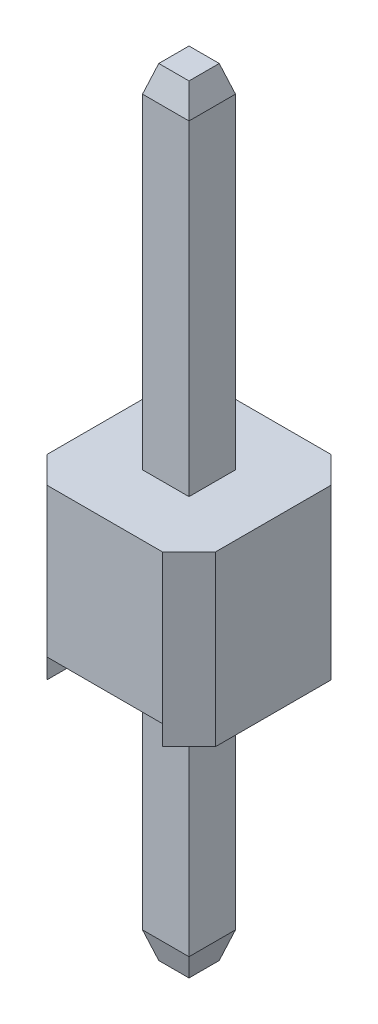
ISO-10303-21;
HEADER;
FILE_DESCRIPTION(('STEP AP214'),'2;1');
FILE_NAME('part.step','',(''),(''),'','','');
FILE_SCHEMA(('AUTOMOTIVE_DESIGN { 1 0 10303 214 1 1 1 1 }'));
ENDSEC;
DATA;
#1=APPLICATION_CONTEXT('core data for automotive mechanical design processes');
#2=APPLICATION_PROTOCOL_DEFINITION('international standard','automotive_design',2000,#1);
#3=PRODUCT_CONTEXT('',#1,'mechanical');
#4=PRODUCT('Part','Part','',(#3));
#5=PRODUCT_RELATED_PRODUCT_CATEGORY('part','',(#4));
#6=PRODUCT_DEFINITION_FORMATION('','',#4);
#7=PRODUCT_DEFINITION_CONTEXT('part definition',#1,'design');
#8=PRODUCT_DEFINITION('design','',#6,#7);
#9=PRODUCT_DEFINITION_SHAPE('','',#8);
#10=(LENGTH_UNIT() NAMED_UNIT(*) SI_UNIT(.MILLI.,.METRE.));
#11=(NAMED_UNIT(*) PLANE_ANGLE_UNIT() SI_UNIT($,.RADIAN.));
#12=(NAMED_UNIT(*) SI_UNIT($,.STERADIAN.) SOLID_ANGLE_UNIT());
#13=UNCERTAINTY_MEASURE_WITH_UNIT(LENGTH_MEASURE(1.E-05),#10,'distance_accuracy_value','');
#14=(GEOMETRIC_REPRESENTATION_CONTEXT(3) GLOBAL_UNCERTAINTY_ASSIGNED_CONTEXT((#13)) GLOBAL_UNIT_ASSIGNED_CONTEXT((#10,
#11,#12)) REPRESENTATION_CONTEXT('',''));
#15=CARTESIAN_POINT('',(0.,0.,0.));
#16=DIRECTION('',(0.,0.,1.));
#17=DIRECTION('',(1.,0.,0.));
#18=AXIS2_PLACEMENT_3D('',#15,#16,#17);
#19=CARTESIAN_POINT('',(0.,0.3,0.));
#20=DIRECTION('',(0.,-1.,0.));
#21=DIRECTION('',(0.,0.,-1.));
#22=AXIS2_PLACEMENT_3D('',#19,#20,#21);
#23=PLANE('',#22);
#24=DIRECTION('',(0.,0.,-1.));
#25=VECTOR('',#24,1.);
#26=CARTESIAN_POINT('',(-0.870000000000001,0.3,1.27));
#27=LINE('',#26,#25);
#28=CARTESIAN_POINT('',(-0.870000000000001,0.3,1.27));
#29=VERTEX_POINT('',#28);
#30=CARTESIAN_POINT('',(-0.870000000000001,0.3,-1.27));
#31=VERTEX_POINT('',#30);
#32=EDGE_CURVE('E242',#29,#31,#27,.T.);
#33=ORIENTED_EDGE('',*,*,#32,.T.);
#34=DIRECTION('',(1.,0.,0.));
#35=VECTOR('',#34,1.);
#36=CARTESIAN_POINT('',(-0.870000000000001,0.3,-1.27));
#37=LINE('',#36,#35);
#38=CARTESIAN_POINT('',(0.869999999999999,0.3,-1.27));
#39=VERTEX_POINT('',#38);
#40=EDGE_CURVE('E245',#31,#39,#37,.T.);
#41=ORIENTED_EDGE('',*,*,#40,.T.);
#42=DIRECTION('',(0.,0.,1.));
#43=VECTOR('',#42,1.);
#44=CARTESIAN_POINT('',(0.869999999999999,0.3,1.27));
#45=LINE('',#44,#43);
#46=CARTESIAN_POINT('',(0.869999999999999,0.3,1.27));
#47=VERTEX_POINT('',#46);
#48=EDGE_CURVE('E249',#39,#47,#45,.T.);
#49=ORIENTED_EDGE('',*,*,#48,.T.);
#50=DIRECTION('',(-1.,0.,0.));
#51=VECTOR('',#50,1.);
#52=CARTESIAN_POINT('',(-0.870000000000001,0.3,1.27));
#53=LINE('',#52,#51);
#54=EDGE_CURVE('E252',#47,#29,#53,.T.);
#55=ORIENTED_EDGE('',*,*,#54,.T.);
#56=EDGE_LOOP('',(#33,#41,#49,#55));
#57=FACE_BOUND('',#56,.T.);
#58=DIRECTION('',(-1.,0.,0.));
#59=VECTOR('',#58,1.);
#60=CARTESIAN_POINT('',(-0.35,0.3,0.35));
#61=LINE('',#60,#59);
#62=CARTESIAN_POINT('',(0.35,0.3,0.35));
#63=VERTEX_POINT('',#62);
#64=CARTESIAN_POINT('',(-0.35,0.3,0.35));
#65=VERTEX_POINT('',#64);
#66=EDGE_CURVE('E211',#63,#65,#61,.T.);
#67=ORIENTED_EDGE('',*,*,#66,.F.);
#68=DIRECTION('',(0.,0.,1.));
#69=VECTOR('',#68,1.);
#70=CARTESIAN_POINT('',(0.35,0.3,0.35));
#71=LINE('',#70,#69);
#72=CARTESIAN_POINT('',(0.35,0.3,-0.35));
#73=VERTEX_POINT('',#72);
#74=EDGE_CURVE('E191',#73,#63,#71,.T.);
#75=ORIENTED_EDGE('',*,*,#74,.F.);
#76=DIRECTION('',(1.,0.,0.));
#77=VECTOR('',#76,1.);
#78=CARTESIAN_POINT('',(-0.35,0.3,-0.35));
#79=LINE('',#78,#77);
#80=CARTESIAN_POINT('',(-0.35,0.3,-0.35));
#81=VERTEX_POINT('',#80);
#82=EDGE_CURVE('E201',#81,#73,#79,.T.);
#83=ORIENTED_EDGE('',*,*,#82,.F.);
#84=DIRECTION('',(0.,0.,-1.));
#85=VECTOR('',#84,1.);
#86=CARTESIAN_POINT('',(-0.35,0.3,0.35));
#87=LINE('',#86,#85);
#88=EDGE_CURVE('E220',#65,#81,#87,.T.);
#89=ORIENTED_EDGE('',*,*,#88,.F.);
#90=EDGE_LOOP('',(#67,#75,#83,#89));
#91=FACE_BOUND('',#90,.T.);
#92=ADVANCED_FACE('F37',(#57,#91),#23,.T.);
#93=CARTESIAN_POINT('',(0.,2.54,0.));
#94=DIRECTION('',(0.,1.,0.));
#95=DIRECTION('',(0.,0.,1.));
#96=AXIS2_PLACEMENT_3D('',#93,#94,#95);
#97=PLANE('',#96);
#98=DIRECTION('',(-1.,0.,0.));
#99=VECTOR('',#98,1.);
#100=CARTESIAN_POINT('',(-1.27,2.54,-1.27));
#101=LINE('',#100,#99);
#102=CARTESIAN_POINT('',(0.869999999999999,2.54,-1.27));
#103=VERTEX_POINT('',#102);
#104=CARTESIAN_POINT('',(-0.869999999999999,2.54,-1.27));
#105=VERTEX_POINT('',#104);
#106=EDGE_CURVE('E265',#103,#105,#101,.T.);
#107=ORIENTED_EDGE('',*,*,#106,.T.);
#108=DIRECTION('',(0.707106781186548,0.,-0.707106781186547));
#109=VECTOR('',#108,1.);
#110=CARTESIAN_POINT('',(-1.07,2.54,-1.07));
#111=LINE('',#110,#109);
#112=CARTESIAN_POINT('',(-1.27,2.54,-0.869999999999999));
#113=VERTEX_POINT('',#112);
#114=EDGE_CURVE('E306',#105,#113,#111,.F.);
#115=ORIENTED_EDGE('',*,*,#114,.T.);
#116=DIRECTION('',(0.,0.,1.));
#117=VECTOR('',#116,1.);
#118=CARTESIAN_POINT('',(-1.27,2.54,-1.27));
#119=LINE('',#118,#117);
#120=CARTESIAN_POINT('',(-1.27,2.54,0.869999999999999));
#121=VERTEX_POINT('',#120);
#122=EDGE_CURVE('E269',#113,#121,#119,.T.);
#123=ORIENTED_EDGE('',*,*,#122,.T.);
#124=DIRECTION('',(-0.707106781186546,0.,-0.707106781186549));
#125=VECTOR('',#124,1.);
#126=CARTESIAN_POINT('',(-1.07,2.54,1.07));
#127=LINE('',#126,#125);
#128=CARTESIAN_POINT('',(-0.87,2.54,1.27));
#129=VERTEX_POINT('',#128);
#130=EDGE_CURVE('E302',#121,#129,#127,.F.);
#131=ORIENTED_EDGE('',*,*,#130,.T.);
#132=DIRECTION('',(1.,0.,0.));
#133=VECTOR('',#132,1.);
#134=CARTESIAN_POINT('',(-1.27,2.54,1.27));
#135=LINE('',#134,#133);
#136=CARTESIAN_POINT('',(0.869999999999998,2.54,1.27));
#137=VERTEX_POINT('',#136);
#138=EDGE_CURVE('E272',#129,#137,#135,.T.);
#139=ORIENTED_EDGE('',*,*,#138,.T.);
#140=DIRECTION('',(-0.707106781186549,0.,0.707106781186546));
#141=VECTOR('',#140,1.);
#142=CARTESIAN_POINT('',(1.07,2.54,1.07));
#143=LINE('',#142,#141);
#144=CARTESIAN_POINT('',(1.27,2.54,0.869999999999999));
#145=VERTEX_POINT('',#144);
#146=EDGE_CURVE('E300',#137,#145,#143,.F.);
#147=ORIENTED_EDGE('',*,*,#146,.T.);
#148=DIRECTION('',(0.,0.,-1.));
#149=VECTOR('',#148,1.);
#150=CARTESIAN_POINT('',(1.27,2.54,-1.27));
#151=LINE('',#150,#149);
#152=CARTESIAN_POINT('',(1.27,2.54,-0.869999999999999));
#153=VERTEX_POINT('',#152);
#154=EDGE_CURVE('E262',#145,#153,#151,.T.);
#155=ORIENTED_EDGE('',*,*,#154,.T.);
#156=DIRECTION('',(0.707106781186547,0.,0.707106781186548));
#157=VECTOR('',#156,1.);
#158=CARTESIAN_POINT('',(1.07,2.54,-1.07));
#159=LINE('',#158,#157);
#160=EDGE_CURVE('E304',#153,#103,#159,.F.);
#161=ORIENTED_EDGE('',*,*,#160,.T.);
#162=EDGE_LOOP('',(#107,#115,#123,#131,#139,#147,#155,#161));
#163=FACE_BOUND('',#162,.T.);
#164=DIRECTION('',(1.,0.,0.));
#165=VECTOR('',#164,1.);
#166=CARTESIAN_POINT('',(0.35,2.54,0.35));
#167=LINE('',#166,#165);
#168=CARTESIAN_POINT('',(-0.35,2.54,0.35));
#169=VERTEX_POINT('',#168);
#170=CARTESIAN_POINT('',(0.35,2.54,0.35));
#171=VERTEX_POINT('',#170);
#172=EDGE_CURVE('E224',#169,#171,#167,.T.);
#173=ORIENTED_EDGE('',*,*,#172,.F.);
#174=DIRECTION('',(0.,0.,1.));
#175=VECTOR('',#174,1.);
#176=CARTESIAN_POINT('',(-0.35,2.54,-0.35));
#177=LINE('',#176,#175);
#178=CARTESIAN_POINT('',(-0.35,2.54,-0.35));
#179=VERTEX_POINT('',#178);
#180=EDGE_CURVE('E208',#179,#169,#177,.T.);
#181=ORIENTED_EDGE('',*,*,#180,.F.);
#182=DIRECTION('',(-1.,0.,0.));
#183=VECTOR('',#182,1.);
#184=CARTESIAN_POINT('',(0.35,2.54,-0.35));
#185=LINE('',#184,#183);
#186=CARTESIAN_POINT('',(0.35,2.54,-0.35));
#187=VERTEX_POINT('',#186);
#188=EDGE_CURVE('E230',#187,#179,#185,.T.);
#189=ORIENTED_EDGE('',*,*,#188,.F.);
#190=DIRECTION('',(0.,0.,-1.));
#191=VECTOR('',#190,1.);
#192=CARTESIAN_POINT('',(0.35,2.54,-0.35));
#193=LINE('',#192,#191);
#194=EDGE_CURVE('E227',#171,#187,#193,.T.);
#195=ORIENTED_EDGE('',*,*,#194,.F.);
#196=EDGE_LOOP('',(#173,#181,#189,#195));
#197=FACE_BOUND('',#196,.T.);
#198=ADVANCED_FACE('F403',(#163,#197),#97,.T.);
#199=CARTESIAN_POINT('',(-1.27,2.54,-1.27));
#200=DIRECTION('',(0.,0.,1.));
#201=DIRECTION('',(1.,0.,0.));
#202=AXIS2_PLACEMENT_3D('',#199,#200,#201);
#203=PLANE('',#202);
#204=ORIENTED_EDGE('',*,*,#40,.F.);
#205=DIRECTION('',(0.,1.,0.));
#206=VECTOR('',#205,1.);
#207=CARTESIAN_POINT('',(-0.869999999999999,2.54,-1.27));
#208=LINE('',#207,#206);
#209=EDGE_CURVE('E297',#31,#105,#208,.T.);
#210=ORIENTED_EDGE('',*,*,#209,.T.);
#211=ORIENTED_EDGE('',*,*,#106,.F.);
#212=DIRECTION('',(0.,-1.,0.));
#213=VECTOR('',#212,1.);
#214=CARTESIAN_POINT('',(0.869999999999999,2.54,-1.27));
#215=LINE('',#214,#213);
#216=EDGE_CURVE('E294',#103,#39,#215,.T.);
#217=ORIENTED_EDGE('',*,*,#216,.T.);
#218=EDGE_LOOP('',(#204,#210,#211,#217));
#219=FACE_BOUND('',#218,.T.);
#220=ADVANCED_FACE('F409',(#219),#203,.F.);
#221=CARTESIAN_POINT('',(-1.27,2.54,1.27));
#222=DIRECTION('',(0.,0.,-1.));
#223=DIRECTION('',(-1.,0.,0.));
#224=AXIS2_PLACEMENT_3D('',#221,#222,#223);
#225=PLANE('',#224);
#226=ORIENTED_EDGE('',*,*,#54,.F.);
#227=DIRECTION('',(0.,1.,0.));
#228=VECTOR('',#227,1.);
#229=CARTESIAN_POINT('',(0.869999999999999,2.54,1.27));
#230=LINE('',#229,#228);
#231=EDGE_CURVE('E313',#47,#137,#230,.T.);
#232=ORIENTED_EDGE('',*,*,#231,.T.);
#233=ORIENTED_EDGE('',*,*,#138,.F.);
#234=DIRECTION('',(0.,-1.,0.));
#235=VECTOR('',#234,1.);
#236=CARTESIAN_POINT('',(-0.87,2.54,1.27));
#237=LINE('',#236,#235);
#238=EDGE_CURVE('E316',#129,#29,#237,.T.);
#239=ORIENTED_EDGE('',*,*,#238,.T.);
#240=EDGE_LOOP('',(#226,#232,#233,#239));
#241=FACE_BOUND('',#240,.T.);
#242=ADVANCED_FACE('F431',(#241),#225,.F.);
#243=CARTESIAN_POINT('',(0.,0.,0.));
#244=DIRECTION('',(0.,1.,0.));
#245=DIRECTION('',(0.,0.,1.));
#246=AXIS2_PLACEMENT_3D('',#243,#244,#245);
#247=PLANE('',#246);
#248=DIRECTION('',(-0.707106781186548,0.,0.707106781186547));
#249=VECTOR('',#248,1.);
#250=CARTESIAN_POINT('',(-1.27,0.,-0.869999999999999));
#251=LINE('',#250,#249);
#252=CARTESIAN_POINT('',(-1.27,0.,-0.869999999999999));
#253=VERTEX_POINT('',#252);
#254=CARTESIAN_POINT('',(-0.870000000000001,0.,-1.27));
#255=VERTEX_POINT('',#254);
#256=EDGE_CURVE('E291',#253,#255,#251,.F.);
#257=ORIENTED_EDGE('',*,*,#256,.T.);
#258=DIRECTION('',(0.,0.,-1.));
#259=VECTOR('',#258,1.);
#260=CARTESIAN_POINT('',(-0.870000000000001,0.,1.27));
#261=LINE('',#260,#259);
#262=CARTESIAN_POINT('',(-0.870000000000001,0.,1.27));
#263=VERTEX_POINT('',#262);
#264=EDGE_CURVE('E241',#263,#255,#261,.T.);
#265=ORIENTED_EDGE('',*,*,#264,.F.);
#266=DIRECTION('',(0.707106781186546,0.,0.707106781186549));
#267=VECTOR('',#266,1.);
#268=CARTESIAN_POINT('',(-0.87,0.,1.27));
#269=LINE('',#268,#267);
#270=CARTESIAN_POINT('',(-1.27,0.,0.869999999999999));
#271=VERTEX_POINT('',#270);
#272=EDGE_CURVE('E287',#263,#271,#269,.F.);
#273=ORIENTED_EDGE('',*,*,#272,.T.);
#274=DIRECTION('',(0.,0.,1.));
#275=VECTOR('',#274,1.);
#276=CARTESIAN_POINT('',(-1.27,0.,-1.27));
#277=LINE('',#276,#275);
#278=EDGE_CURVE('E266',#253,#271,#277,.T.);
#279=ORIENTED_EDGE('',*,*,#278,.F.);
#280=EDGE_LOOP('',(#257,#265,#273,#279));
#281=FACE_BOUND('',#280,.T.);
#282=ADVANCED_FACE('F430',(#281),#247,.F.);
#283=CARTESIAN_POINT('',(1.27,2.54,-1.27));
#284=DIRECTION('',(-1.,0.,0.));
#285=DIRECTION('',(0.,0.,1.));
#286=AXIS2_PLACEMENT_3D('',#283,#284,#285);
#287=PLANE('',#286);
#288=DIRECTION('',(0.,0.,-1.));
#289=VECTOR('',#288,1.);
#290=CARTESIAN_POINT('',(1.27,0.,-1.27));
#291=LINE('',#290,#289);
#292=CARTESIAN_POINT('',(1.27,0.,0.87));
#293=VERTEX_POINT('',#292);
#294=CARTESIAN_POINT('',(1.27,0.,-0.869999999999998));
#295=VERTEX_POINT('',#294);
#296=EDGE_CURVE('E260',#293,#295,#291,.T.);
#297=ORIENTED_EDGE('',*,*,#296,.T.);
#298=DIRECTION('',(0.,1.,0.));
#299=VECTOR('',#298,1.);
#300=CARTESIAN_POINT('',(1.27,2.54,-0.869999999999998));
#301=LINE('',#300,#299);
#302=EDGE_CURVE('E311',#295,#153,#301,.T.);
#303=ORIENTED_EDGE('',*,*,#302,.T.);
#304=ORIENTED_EDGE('',*,*,#154,.F.);
#305=DIRECTION('',(0.,-1.,0.));
#306=VECTOR('',#305,1.);
#307=CARTESIAN_POINT('',(1.27,2.54,0.870000000000001));
#308=LINE('',#307,#306);
#309=EDGE_CURVE('E308',#145,#293,#308,.T.);
#310=ORIENTED_EDGE('',*,*,#309,.T.);
#311=EDGE_LOOP('',(#297,#303,#304,#310));
#312=FACE_BOUND('',#311,.T.);
#313=ADVANCED_FACE('F437',(#312),#287,.F.);
#314=CARTESIAN_POINT('',(-1.27,2.54,-1.27));
#315=DIRECTION('',(1.,0.,0.));
#316=DIRECTION('',(0.,0.,-1.));
#317=AXIS2_PLACEMENT_3D('',#314,#315,#316);
#318=PLANE('',#317);
#319=ORIENTED_EDGE('',*,*,#122,.F.);
#320=DIRECTION('',(0.,-1.,0.));
#321=VECTOR('',#320,1.);
#322=CARTESIAN_POINT('',(-1.27,2.54,-0.869999999999999));
#323=LINE('',#322,#321);
#324=EDGE_CURVE('E281',#113,#253,#323,.T.);
#325=ORIENTED_EDGE('',*,*,#324,.T.);
#326=ORIENTED_EDGE('',*,*,#278,.T.);
#327=DIRECTION('',(0.,1.,0.));
#328=VECTOR('',#327,1.);
#329=CARTESIAN_POINT('',(-1.27,2.54,0.869999999999999));
#330=LINE('',#329,#328);
#331=EDGE_CURVE('E275',#271,#121,#330,.T.);
#332=ORIENTED_EDGE('',*,*,#331,.T.);
#333=EDGE_LOOP('',(#319,#325,#326,#332));
#334=FACE_BOUND('',#333,.T.);
#335=ADVANCED_FACE('F428',(#334),#318,.F.);
#336=DIRECTION('',(0.707106781186549,0.,-0.707106781186546));
#337=VECTOR('',#336,1.);
#338=CARTESIAN_POINT('',(1.27,0.,0.870000000000001));
#339=LINE('',#338,#337);
#340=CARTESIAN_POINT('',(0.869999999999999,0.,1.27));
#341=VERTEX_POINT('',#340);
#342=EDGE_CURVE('E284',#293,#341,#339,.F.);
#343=ORIENTED_EDGE('',*,*,#342,.T.);
#344=DIRECTION('',(0.,0.,1.));
#345=VECTOR('',#344,1.);
#346=CARTESIAN_POINT('',(0.869999999999999,0.,1.27));
#347=LINE('',#346,#345);
#348=CARTESIAN_POINT('',(0.869999999999999,0.,-1.27));
#349=VERTEX_POINT('',#348);
#350=EDGE_CURVE('E246',#349,#341,#347,.T.);
#351=ORIENTED_EDGE('',*,*,#350,.F.);
#352=DIRECTION('',(-0.707106781186547,0.,-0.707106781186548));
#353=VECTOR('',#352,1.);
#354=CARTESIAN_POINT('',(0.869999999999999,0.,-1.27));
#355=LINE('',#354,#353);
#356=EDGE_CURVE('E289',#349,#295,#355,.F.);
#357=ORIENTED_EDGE('',*,*,#356,.T.);
#358=ORIENTED_EDGE('',*,*,#296,.F.);
#359=EDGE_LOOP('',(#343,#351,#357,#358));
#360=FACE_BOUND('',#359,.T.);
#361=ADVANCED_FACE('F424',(#360),#247,.F.);
#362=CARTESIAN_POINT('',(-1.27,2.54,-0.869999999999999));
#363=DIRECTION('',(0.707106781186547,0.,0.707106781186548));
#364=DIRECTION('',(0.,-1.,0.));
#365=AXIS2_PLACEMENT_3D('',#362,#363,#364);
#366=PLANE('',#365);
#367=ORIENTED_EDGE('',*,*,#114,.F.);
#368=ORIENTED_EDGE('',*,*,#209,.F.);
#369=EDGE_CURVE('E298',#255,#31,#208,.T.);
#370=ORIENTED_EDGE('',*,*,#369,.F.);
#371=ORIENTED_EDGE('',*,*,#256,.F.);
#372=ORIENTED_EDGE('',*,*,#324,.F.);
#373=EDGE_LOOP('',(#367,#368,#370,#371,#372));
#374=FACE_BOUND('',#373,.T.);
#375=ADVANCED_FACE('F427',(#374),#366,.F.);
#376=CARTESIAN_POINT('',(0.869999999999999,2.54,-1.27));
#377=DIRECTION('',(-0.707106781186548,0.,0.707106781186547));
#378=DIRECTION('',(0.,-1.,0.));
#379=AXIS2_PLACEMENT_3D('',#376,#377,#378);
#380=PLANE('',#379);
#381=ORIENTED_EDGE('',*,*,#160,.F.);
#382=ORIENTED_EDGE('',*,*,#302,.F.);
#383=ORIENTED_EDGE('',*,*,#356,.F.);
#384=DIRECTION('',(0.,-1.,0.));
#385=VECTOR('',#384,1.);
#386=CARTESIAN_POINT('',(0.869999999999999,0.3,-1.27));
#387=LINE('',#386,#385);
#388=EDGE_CURVE('E255',#39,#349,#387,.T.);
#389=ORIENTED_EDGE('',*,*,#388,.F.);
#390=ORIENTED_EDGE('',*,*,#216,.F.);
#391=EDGE_LOOP('',(#381,#382,#383,#389,#390));
#392=FACE_BOUND('',#391,.T.);
#393=ADVANCED_FACE('F447',(#392),#380,.F.);
#394=CARTESIAN_POINT('',(-0.87,2.54,1.27));
#395=DIRECTION('',(0.707106781186549,0.,-0.707106781186546));
#396=DIRECTION('',(0.,-1.,0.));
#397=AXIS2_PLACEMENT_3D('',#394,#395,#396);
#398=PLANE('',#397);
#399=ORIENTED_EDGE('',*,*,#130,.F.);
#400=ORIENTED_EDGE('',*,*,#331,.F.);
#401=ORIENTED_EDGE('',*,*,#272,.F.);
#402=DIRECTION('',(0.,-1.,0.));
#403=VECTOR('',#402,1.);
#404=CARTESIAN_POINT('',(-0.870000000000001,0.3,1.27));
#405=LINE('',#404,#403);
#406=EDGE_CURVE('E258',#29,#263,#405,.T.);
#407=ORIENTED_EDGE('',*,*,#406,.F.);
#408=ORIENTED_EDGE('',*,*,#238,.F.);
#409=EDGE_LOOP('',(#399,#400,#401,#407,#408));
#410=FACE_BOUND('',#409,.T.);
#411=ADVANCED_FACE('F451',(#410),#398,.F.);
#412=CARTESIAN_POINT('',(1.27,2.54,0.870000000000001));
#413=DIRECTION('',(-0.707106781186546,0.,-0.707106781186549));
#414=DIRECTION('',(0.,-1.,0.));
#415=AXIS2_PLACEMENT_3D('',#412,#413,#414);
#416=PLANE('',#415);
#417=ORIENTED_EDGE('',*,*,#146,.F.);
#418=ORIENTED_EDGE('',*,*,#231,.F.);
#419=EDGE_CURVE('E314',#341,#47,#230,.T.);
#420=ORIENTED_EDGE('',*,*,#419,.F.);
#421=ORIENTED_EDGE('',*,*,#342,.F.);
#422=ORIENTED_EDGE('',*,*,#309,.F.);
#423=EDGE_LOOP('',(#417,#418,#420,#421,#422));
#424=FACE_BOUND('',#423,.T.);
#425=ADVANCED_FACE('F421',(#424),#416,.F.);
#426=CARTESIAN_POINT('',(-0.870000000000001,0.3,1.27));
#427=DIRECTION('',(-1.,0.,0.));
#428=DIRECTION('',(0.,0.,1.));
#429=AXIS2_PLACEMENT_3D('',#426,#427,#428);
#430=PLANE('',#429);
#431=ORIENTED_EDGE('',*,*,#264,.T.);
#432=ORIENTED_EDGE('',*,*,#369,.T.);
#433=ORIENTED_EDGE('',*,*,#32,.F.);
#434=ORIENTED_EDGE('',*,*,#406,.T.);
#435=EDGE_LOOP('',(#431,#432,#433,#434));
#436=FACE_BOUND('',#435,.T.);
#437=ADVANCED_FACE('F418',(#436),#430,.F.);
#438=CARTESIAN_POINT('',(0.869999999999999,0.3,1.27));
#439=DIRECTION('',(1.,0.,0.));
#440=DIRECTION('',(0.,0.,-1.));
#441=AXIS2_PLACEMENT_3D('',#438,#439,#440);
#442=PLANE('',#441);
#443=ORIENTED_EDGE('',*,*,#350,.T.);
#444=ORIENTED_EDGE('',*,*,#419,.T.);
#445=ORIENTED_EDGE('',*,*,#48,.F.);
#446=ORIENTED_EDGE('',*,*,#388,.T.);
#447=EDGE_LOOP('',(#443,#444,#445,#446));
#448=FACE_BOUND('',#447,.T.);
#449=ADVANCED_FACE('F415',(#448),#442,.F.);
#450=CARTESIAN_POINT('',(-0.35,7.84,-0.35));
#451=DIRECTION('',(1.,0.,0.));
#452=DIRECTION('',(0.,0.,-1.));
#453=AXIS2_PLACEMENT_3D('',#450,#451,#452);
#454=PLANE('',#453);
#455=DIRECTION('',(0.,-1.,0.));
#456=VECTOR('',#455,1.);
#457=CARTESIAN_POINT('',(-0.35,7.84,0.35));
#458=LINE('',#457,#456);
#459=CARTESIAN_POINT('',(-0.35,7.44,0.35));
#460=VERTEX_POINT('',#459);
#461=EDGE_CURVE('E239',#460,#169,#458,.T.);
#462=ORIENTED_EDGE('',*,*,#461,.F.);
#463=DIRECTION('',(0.,0.,-1.));
#464=VECTOR('',#463,1.);
#465=CARTESIAN_POINT('',(-0.35,7.44,-0.35));
#466=LINE('',#465,#464);
#467=CARTESIAN_POINT('',(-0.35,7.44,-0.35));
#468=VERTEX_POINT('',#467);
#469=EDGE_CURVE('E347',#460,#468,#466,.T.);
#470=ORIENTED_EDGE('',*,*,#469,.T.);
#471=DIRECTION('',(0.,-1.,0.));
#472=VECTOR('',#471,1.);
#473=CARTESIAN_POINT('',(-0.35,7.84,-0.35));
#474=LINE('',#473,#472);
#475=EDGE_CURVE('E233',#468,#179,#474,.T.);
#476=ORIENTED_EDGE('',*,*,#475,.T.);
#477=ORIENTED_EDGE('',*,*,#180,.T.);
#478=EDGE_LOOP('',(#462,#470,#476,#477));
#479=FACE_BOUND('',#478,.T.);
#480=ADVANCED_FACE('F380',(#479),#454,.F.);
#481=CARTESIAN_POINT('',(0.35,7.84,0.35));
#482=DIRECTION('',(0.,0.,-1.));
#483=DIRECTION('',(-1.,0.,0.));
#484=AXIS2_PLACEMENT_3D('',#481,#482,#483);
#485=PLANE('',#484);
#486=DIRECTION('',(0.,-1.,0.));
#487=VECTOR('',#486,1.);
#488=CARTESIAN_POINT('',(0.35,7.84,0.35));
#489=LINE('',#488,#487);
#490=CARTESIAN_POINT('',(0.35,7.44,0.35));
#491=VERTEX_POINT('',#490);
#492=EDGE_CURVE('E237',#491,#171,#489,.T.);
#493=ORIENTED_EDGE('',*,*,#492,.F.);
#494=DIRECTION('',(-1.,0.,0.));
#495=VECTOR('',#494,1.);
#496=CARTESIAN_POINT('',(0.35,7.44,0.35));
#497=LINE('',#496,#495);
#498=EDGE_CURVE('E12',#491,#460,#497,.T.);
#499=ORIENTED_EDGE('',*,*,#498,.T.);
#500=ORIENTED_EDGE('',*,*,#461,.T.);
#501=ORIENTED_EDGE('',*,*,#172,.T.);
#502=EDGE_LOOP('',(#493,#499,#500,#501));
#503=FACE_BOUND('',#502,.T.);
#504=ADVANCED_FACE('F552',(#503),#485,.F.);
#505=CARTESIAN_POINT('',(0.35,7.84,-0.35));
#506=DIRECTION('',(-1.,0.,0.));
#507=DIRECTION('',(0.,0.,1.));
#508=AXIS2_PLACEMENT_3D('',#505,#506,#507);
#509=PLANE('',#508);
#510=DIRECTION('',(0.,-1.,0.));
#511=VECTOR('',#510,1.);
#512=CARTESIAN_POINT('',(0.35,7.84,-0.35));
#513=LINE('',#512,#511);
#514=CARTESIAN_POINT('',(0.35,7.44,-0.35));
#515=VERTEX_POINT('',#514);
#516=EDGE_CURVE('E235',#515,#187,#513,.T.);
#517=ORIENTED_EDGE('',*,*,#516,.F.);
#518=DIRECTION('',(0.,0.,1.));
#519=VECTOR('',#518,1.);
#520=CARTESIAN_POINT('',(0.35,7.44,-0.35));
#521=LINE('',#520,#519);
#522=EDGE_CURVE('E46',#515,#491,#521,.T.);
#523=ORIENTED_EDGE('',*,*,#522,.T.);
#524=ORIENTED_EDGE('',*,*,#492,.T.);
#525=ORIENTED_EDGE('',*,*,#194,.T.);
#526=EDGE_LOOP('',(#517,#523,#524,#525));
#527=FACE_BOUND('',#526,.T.);
#528=ADVANCED_FACE('F399',(#527),#509,.F.);
#529=CARTESIAN_POINT('',(0.35,7.84,-0.35));
#530=DIRECTION('',(0.,0.,1.));
#531=DIRECTION('',(1.,0.,0.));
#532=AXIS2_PLACEMENT_3D('',#529,#530,#531);
#533=PLANE('',#532);
#534=ORIENTED_EDGE('',*,*,#475,.F.);
#535=DIRECTION('',(1.,0.,0.));
#536=VECTOR('',#535,1.);
#537=CARTESIAN_POINT('',(0.35,7.44,-0.35));
#538=LINE('',#537,#536);
#539=EDGE_CURVE('E344',#468,#515,#538,.T.);
#540=ORIENTED_EDGE('',*,*,#539,.T.);
#541=ORIENTED_EDGE('',*,*,#516,.T.);
#542=ORIENTED_EDGE('',*,*,#188,.T.);
#543=EDGE_LOOP('',(#534,#540,#541,#542));
#544=FACE_BOUND('',#543,.T.);
#545=ADVANCED_FACE('F383',(#544),#533,.F.);
#546=CARTESIAN_POINT('',(0.,7.84,0.));
#547=DIRECTION('',(0.,-1.,0.));
#548=DIRECTION('',(0.,0.,-1.));
#549=AXIS2_PLACEMENT_3D('',#546,#547,#548);
#550=PLANE('',#549);
#551=DIRECTION('',(0.,0.,-1.));
#552=VECTOR('',#551,1.);
#553=CARTESIAN_POINT('',(0.227707727416535,7.84,0.));
#554=LINE('',#553,#552);
#555=CARTESIAN_POINT('',(0.227707727416535,7.84,0.227707727416535));
#556=VERTEX_POINT('',#555);
#557=CARTESIAN_POINT('',(0.227707727416535,7.84,-0.227707727416536));
#558=VERTEX_POINT('',#557);
#559=EDGE_CURVE('E337',#556,#558,#554,.T.);
#560=ORIENTED_EDGE('',*,*,#559,.T.);
#561=DIRECTION('',(-1.,0.,0.));
#562=VECTOR('',#561,1.);
#563=CARTESIAN_POINT('',(0.,7.84,-0.227707727416536));
#564=LINE('',#563,#562);
#565=CARTESIAN_POINT('',(-0.227707727416536,7.84,-0.227707727416536));
#566=VERTEX_POINT('',#565);
#567=EDGE_CURVE('E341',#558,#566,#564,.T.);
#568=ORIENTED_EDGE('',*,*,#567,.T.);
#569=DIRECTION('',(0.,0.,1.));
#570=VECTOR('',#569,1.);
#571=CARTESIAN_POINT('',(-0.227707727416536,7.84,0.));
#572=LINE('',#571,#570);
#573=CARTESIAN_POINT('',(-0.227707727416536,7.84,0.227707727416536));
#574=VERTEX_POINT('',#573);
#575=EDGE_CURVE('E339',#566,#574,#572,.T.);
#576=ORIENTED_EDGE('',*,*,#575,.T.);
#577=DIRECTION('',(1.,0.,0.));
#578=VECTOR('',#577,1.);
#579=CARTESIAN_POINT('',(0.,7.84,0.227707727416535));
#580=LINE('',#579,#578);
#581=EDGE_CURVE('E335',#574,#556,#580,.T.);
#582=ORIENTED_EDGE('',*,*,#581,.T.);
#583=EDGE_LOOP('',(#560,#568,#576,#582));
#584=FACE_BOUND('',#583,.T.);
#585=ADVANCED_FACE('F390',(#584),#550,.F.);
#586=CARTESIAN_POINT('',(0.35,-16.5499494936612,0.35));
#587=DIRECTION('',(-1.,0.,0.));
#588=DIRECTION('',(0.,0.,1.));
#589=AXIS2_PLACEMENT_3D('',#586,#587,#588);
#590=PLANE('',#589);
#591=DIRECTION('',(0.,1.,0.));
#592=VECTOR('',#591,1.);
#593=CARTESIAN_POINT('',(0.35,-16.5499494936612,0.35));
#594=LINE('',#593,#592);
#595=CARTESIAN_POINT('',(0.35,-3.45999999999999,0.35));
#596=VERTEX_POINT('',#595);
#597=EDGE_CURVE('E212',#596,#63,#594,.T.);
#598=ORIENTED_EDGE('',*,*,#597,.F.);
#599=DIRECTION('',(0.,0.,-1.));
#600=VECTOR('',#599,1.);
#601=CARTESIAN_POINT('',(0.35,-3.45999999999999,-0.35));
#602=LINE('',#601,#600);
#603=CARTESIAN_POINT('',(0.35,-3.45999999999999,-0.35));
#604=VERTEX_POINT('',#603);
#605=EDGE_CURVE('E194',#596,#604,#602,.T.);
#606=ORIENTED_EDGE('',*,*,#605,.T.);
#607=DIRECTION('',(0.,1.,0.));
#608=VECTOR('',#607,1.);
#609=CARTESIAN_POINT('',(0.35,-16.5499494936612,-0.35));
#610=LINE('',#609,#608);
#611=EDGE_CURVE('E186',#604,#73,#610,.T.);
#612=ORIENTED_EDGE('',*,*,#611,.T.);
#613=ORIENTED_EDGE('',*,*,#74,.T.);
#614=EDGE_LOOP('',(#598,#606,#612,#613));
#615=FACE_BOUND('',#614,.T.);
#616=ADVANCED_FACE('F189',(#615),#590,.F.);
#617=CARTESIAN_POINT('',(-0.35,-16.5499494936612,0.35));
#618=DIRECTION('',(0.,0.,-1.));
#619=DIRECTION('',(-1.,0.,0.));
#620=AXIS2_PLACEMENT_3D('',#617,#618,#619);
#621=PLANE('',#620);
#622=DIRECTION('',(0.,1.,0.));
#623=VECTOR('',#622,1.);
#624=CARTESIAN_POINT('',(-0.35,-16.5499494936612,0.35));
#625=LINE('',#624,#623);
#626=CARTESIAN_POINT('',(-0.35,-3.45999999999999,0.35));
#627=VERTEX_POINT('',#626);
#628=EDGE_CURVE('E218',#627,#65,#625,.T.);
#629=ORIENTED_EDGE('',*,*,#628,.F.);
#630=DIRECTION('',(1.,0.,0.));
#631=VECTOR('',#630,1.);
#632=CARTESIAN_POINT('',(0.35,-3.45999999999999,0.35));
#633=LINE('',#632,#631);
#634=EDGE_CURVE('E333',#627,#596,#633,.T.);
#635=ORIENTED_EDGE('',*,*,#634,.T.);
#636=ORIENTED_EDGE('',*,*,#597,.T.);
#637=ORIENTED_EDGE('',*,*,#66,.T.);
#638=EDGE_LOOP('',(#629,#635,#636,#637));
#639=FACE_BOUND('',#638,.T.);
#640=ADVANCED_FACE('F397',(#639),#621,.F.);
#641=CARTESIAN_POINT('',(-0.35,-16.5499494936612,0.35));
#642=DIRECTION('',(1.,0.,0.));
#643=DIRECTION('',(0.,0.,-1.));
#644=AXIS2_PLACEMENT_3D('',#641,#642,#643);
#645=PLANE('',#644);
#646=DIRECTION('',(0.,1.,0.));
#647=VECTOR('',#646,1.);
#648=CARTESIAN_POINT('',(-0.35,-16.5499494936612,-0.35));
#649=LINE('',#648,#647);
#650=CARTESIAN_POINT('',(-0.35,-3.45999999999999,-0.35));
#651=VERTEX_POINT('',#650);
#652=EDGE_CURVE('E204',#651,#81,#649,.T.);
#653=ORIENTED_EDGE('',*,*,#652,.F.);
#654=DIRECTION('',(0.,0.,1.));
#655=VECTOR('',#654,1.);
#656=CARTESIAN_POINT('',(-0.35,-3.45999999999999,0.35));
#657=LINE('',#656,#655);
#658=EDGE_CURVE('E330',#651,#627,#657,.T.);
#659=ORIENTED_EDGE('',*,*,#658,.T.);
#660=ORIENTED_EDGE('',*,*,#628,.T.);
#661=ORIENTED_EDGE('',*,*,#88,.T.);
#662=EDGE_LOOP('',(#653,#659,#660,#661));
#663=FACE_BOUND('',#662,.T.);
#664=ADVANCED_FACE('F513',(#663),#645,.F.);
#665=CARTESIAN_POINT('',(-0.35,-16.5499494936612,-0.35));
#666=DIRECTION('',(0.,0.,1.));
#667=DIRECTION('',(1.,0.,0.));
#668=AXIS2_PLACEMENT_3D('',#665,#666,#667);
#669=PLANE('',#668);
#670=ORIENTED_EDGE('',*,*,#611,.F.);
#671=DIRECTION('',(-1.,0.,0.));
#672=VECTOR('',#671,1.);
#673=CARTESIAN_POINT('',(-0.35,-3.45999999999999,-0.35));
#674=LINE('',#673,#672);
#675=EDGE_CURVE('E328',#604,#651,#674,.T.);
#676=ORIENTED_EDGE('',*,*,#675,.T.);
#677=ORIENTED_EDGE('',*,*,#652,.T.);
#678=ORIENTED_EDGE('',*,*,#82,.T.);
#679=EDGE_LOOP('',(#670,#676,#677,#678));
#680=FACE_BOUND('',#679,.T.);
#681=ADVANCED_FACE('F202',(#680),#669,.F.);
#682=CARTESIAN_POINT('',(0.,-3.86,0.));
#683=DIRECTION('',(0.,-1.,0.));
#684=DIRECTION('',(0.,0.,-1.));
#685=AXIS2_PLACEMENT_3D('',#682,#683,#684);
#686=PLANE('',#685);
#687=DIRECTION('',(0.,0.,-1.));
#688=VECTOR('',#687,1.);
#689=CARTESIAN_POINT('',(-0.227707727416535,-3.86,-0.35));
#690=LINE('',#689,#688);
#691=CARTESIAN_POINT('',(-0.227707727416535,-3.86,0.227707727416535));
#692=VERTEX_POINT('',#691);
#693=CARTESIAN_POINT('',(-0.227707727416535,-3.86,-0.227707727416535));
#694=VERTEX_POINT('',#693);
#695=EDGE_CURVE('E323',#692,#694,#690,.T.);
#696=ORIENTED_EDGE('',*,*,#695,.T.);
#697=DIRECTION('',(1.,0.,0.));
#698=VECTOR('',#697,1.);
#699=CARTESIAN_POINT('',(0.35,-3.86,-0.227707727416535));
#700=LINE('',#699,#698);
#701=CARTESIAN_POINT('',(0.227707727416535,-3.86,-0.227707727416535));
#702=VERTEX_POINT('',#701);
#703=EDGE_CURVE('E325',#694,#702,#700,.T.);
#704=ORIENTED_EDGE('',*,*,#703,.T.);
#705=DIRECTION('',(0.,0.,1.));
#706=VECTOR('',#705,1.);
#707=CARTESIAN_POINT('',(0.227707727416535,-3.86,0.35));
#708=LINE('',#707,#706);
#709=CARTESIAN_POINT('',(0.227707727416535,-3.86,0.227707727416535));
#710=VERTEX_POINT('',#709);
#711=EDGE_CURVE('E321',#702,#710,#708,.T.);
#712=ORIENTED_EDGE('',*,*,#711,.T.);
#713=DIRECTION('',(-1.,0.,0.));
#714=VECTOR('',#713,1.);
#715=CARTESIAN_POINT('',(-0.35,-3.86,0.227707727416535));
#716=LINE('',#715,#714);
#717=EDGE_CURVE('E319',#710,#692,#716,.T.);
#718=ORIENTED_EDGE('',*,*,#717,.T.);
#719=EDGE_LOOP('',(#696,#704,#712,#718));
#720=FACE_BOUND('',#719,.T.);
#721=ADVANCED_FACE('F474',(#720),#686,.T.);
#722=CARTESIAN_POINT('',(0.,-3.86,0.227707727416535));
#723=DIRECTION('',(0.,-0.292371704722734,0.956304755963036));
#724=DIRECTION('',(1.,0.,0.));
#725=AXIS2_PLACEMENT_3D('',#722,#723,#724);
#726=PLANE('',#725);
#727=DIRECTION('',(0.280623595142125,0.917878420979063,0.280623595142125));
#728=VECTOR('',#727,1.);
#729=CARTESIAN_POINT('',(0.20977583447589,-3.91865257897928,0.209775834475891));
#730=LINE('',#729,#728);
#731=EDGE_CURVE('E354',#596,#710,#730,.F.);
#732=ORIENTED_EDGE('',*,*,#731,.F.);
#733=ORIENTED_EDGE('',*,*,#634,.F.);
#734=DIRECTION('',(0.280623595142125,-0.917878420979062,-0.280623595142125));
#735=VECTOR('',#734,1.);
#736=CARTESIAN_POINT('',(-0.209775834475891,-3.91865257897928,0.20977583447589));
#737=LINE('',#736,#735);
#738=EDGE_CURVE('E198',#692,#627,#737,.F.);
#739=ORIENTED_EDGE('',*,*,#738,.F.);
#740=ORIENTED_EDGE('',*,*,#717,.F.);
#741=EDGE_LOOP('',(#732,#733,#739,#740));
#742=FACE_BOUND('',#741,.T.);
#743=ADVANCED_FACE('F470',(#742),#726,.T.);
#744=CARTESIAN_POINT('',(-0.227707727416535,-3.86,0.));
#745=DIRECTION('',(-0.956304755963036,-0.292371704722734,0.));
#746=DIRECTION('',(0.,0.,1.));
#747=AXIS2_PLACEMENT_3D('',#744,#745,#746);
#748=PLANE('',#747);
#749=ORIENTED_EDGE('',*,*,#738,.T.);
#750=ORIENTED_EDGE('',*,*,#658,.F.);
#751=DIRECTION('',(0.280623595142125,-0.917878420979063,0.280623595142125));
#752=VECTOR('',#751,1.);
#753=CARTESIAN_POINT('',(-0.209775834475891,-3.91865257897928,-0.20977583447589));
#754=LINE('',#753,#752);
#755=EDGE_CURVE('E352',#694,#651,#754,.F.);
#756=ORIENTED_EDGE('',*,*,#755,.F.);
#757=ORIENTED_EDGE('',*,*,#695,.F.);
#758=EDGE_LOOP('',(#749,#750,#756,#757));
#759=FACE_BOUND('',#758,.T.);
#760=ADVANCED_FACE('F466',(#759),#748,.T.);
#761=CARTESIAN_POINT('',(0.227707727416535,-3.86,0.));
#762=DIRECTION('',(0.956304755963036,-0.292371704722734,0.));
#763=DIRECTION('',(0.,0.,-1.));
#764=AXIS2_PLACEMENT_3D('',#761,#762,#763);
#765=PLANE('',#764);
#766=ORIENTED_EDGE('',*,*,#731,.T.);
#767=ORIENTED_EDGE('',*,*,#711,.F.);
#768=DIRECTION('',(0.280623595142125,0.917878420979062,-0.280623595142125));
#769=VECTOR('',#768,1.);
#770=CARTESIAN_POINT('',(0.20977583447589,-3.91865257897928,-0.20977583447589));
#771=LINE('',#770,#769);
#772=EDGE_CURVE('E350',#604,#702,#771,.F.);
#773=ORIENTED_EDGE('',*,*,#772,.F.);
#774=ORIENTED_EDGE('',*,*,#605,.F.);
#775=EDGE_LOOP('',(#766,#767,#773,#774));
#776=FACE_BOUND('',#775,.T.);
#777=ADVANCED_FACE('F462',(#776),#765,.T.);
#778=CARTESIAN_POINT('',(0.,-3.86,-0.227707727416535));
#779=DIRECTION('',(0.,-0.292371704722734,-0.956304755963036));
#780=DIRECTION('',(-1.,0.,0.));
#781=AXIS2_PLACEMENT_3D('',#778,#779,#780);
#782=PLANE('',#781);
#783=ORIENTED_EDGE('',*,*,#755,.T.);
#784=ORIENTED_EDGE('',*,*,#675,.F.);
#785=ORIENTED_EDGE('',*,*,#772,.T.);
#786=ORIENTED_EDGE('',*,*,#703,.F.);
#787=EDGE_LOOP('',(#783,#784,#785,#786));
#788=FACE_BOUND('',#787,.T.);
#789=ADVANCED_FACE('F459',(#788),#782,.T.);
#790=CARTESIAN_POINT('',(0.,7.84,0.227707727416535));
#791=DIRECTION('',(0.,-0.292371704722735,-0.956304755963036));
#792=DIRECTION('',(1.,0.,0.));
#793=AXIS2_PLACEMENT_3D('',#790,#791,#792);
#794=PLANE('',#793);
#795=DIRECTION('',(-0.280623595142126,-0.917878420979062,0.280623595142126));
#796=VECTOR('',#795,1.);
#797=CARTESIAN_POINT('',(-0.209775834475891,7.89865257897929,0.209775834475891));
#798=LINE('',#797,#796);
#799=EDGE_CURVE('E362',#460,#574,#798,.F.);
#800=ORIENTED_EDGE('',*,*,#799,.F.);
#801=ORIENTED_EDGE('',*,*,#498,.F.);
#802=DIRECTION('',(-0.280623595142126,0.917878420979062,-0.280623595142126));
#803=VECTOR('',#802,1.);
#804=CARTESIAN_POINT('',(0.209775834475891,7.89865257897929,0.209775834475891));
#805=LINE('',#804,#803);
#806=EDGE_CURVE('E41',#556,#491,#805,.F.);
#807=ORIENTED_EDGE('',*,*,#806,.F.);
#808=ORIENTED_EDGE('',*,*,#581,.F.);
#809=EDGE_LOOP('',(#800,#801,#807,#808));
#810=FACE_BOUND('',#809,.T.);
#811=ADVANCED_FACE('F39',(#810),#794,.F.);
#812=CARTESIAN_POINT('',(0.227707727416535,7.84,0.));
#813=DIRECTION('',(-0.956304755963036,-0.292371704722735,0.));
#814=DIRECTION('',(0.,0.,-1.));
#815=AXIS2_PLACEMENT_3D('',#812,#813,#814);
#816=PLANE('',#815);
#817=ORIENTED_EDGE('',*,*,#806,.T.);
#818=ORIENTED_EDGE('',*,*,#522,.F.);
#819=DIRECTION('',(-0.280623595142126,0.917878420979062,0.280623595142126));
#820=VECTOR('',#819,1.);
#821=CARTESIAN_POINT('',(0.209775834475891,7.89865257897929,-0.209775834475891));
#822=LINE('',#821,#820);
#823=EDGE_CURVE('E361',#558,#515,#822,.F.);
#824=ORIENTED_EDGE('',*,*,#823,.F.);
#825=ORIENTED_EDGE('',*,*,#559,.F.);
#826=EDGE_LOOP('',(#817,#818,#824,#825));
#827=FACE_BOUND('',#826,.T.);
#828=ADVANCED_FACE('F372',(#827),#816,.F.);
#829=CARTESIAN_POINT('',(-0.227707727416536,7.84,0.));
#830=DIRECTION('',(0.956304755963036,-0.292371704722735,0.));
#831=DIRECTION('',(0.,0.,1.));
#832=AXIS2_PLACEMENT_3D('',#829,#830,#831);
#833=PLANE('',#832);
#834=ORIENTED_EDGE('',*,*,#799,.T.);
#835=ORIENTED_EDGE('',*,*,#575,.F.);
#836=DIRECTION('',(-0.280623595142126,-0.917878420979062,-0.280623595142126));
#837=VECTOR('',#836,1.);
#838=CARTESIAN_POINT('',(-0.209775834475891,7.89865257897929,-0.209775834475891));
#839=LINE('',#838,#837);
#840=EDGE_CURVE('E359',#468,#566,#839,.F.);
#841=ORIENTED_EDGE('',*,*,#840,.F.);
#842=ORIENTED_EDGE('',*,*,#469,.F.);
#843=EDGE_LOOP('',(#834,#835,#841,#842));
#844=FACE_BOUND('',#843,.T.);
#845=ADVANCED_FACE('F377',(#844),#833,.F.);
#846=CARTESIAN_POINT('',(0.,7.84,-0.227707727416536));
#847=DIRECTION('',(0.,-0.292371704722735,0.956304755963036));
#848=DIRECTION('',(-1.,0.,0.));
#849=AXIS2_PLACEMENT_3D('',#846,#847,#848);
#850=PLANE('',#849);
#851=ORIENTED_EDGE('',*,*,#823,.T.);
#852=ORIENTED_EDGE('',*,*,#539,.F.);
#853=ORIENTED_EDGE('',*,*,#840,.T.);
#854=ORIENTED_EDGE('',*,*,#567,.F.);
#855=EDGE_LOOP('',(#851,#852,#853,#854));
#856=FACE_BOUND('',#855,.T.);
#857=ADVANCED_FACE('F387',(#856),#850,.F.);
#858=CLOSED_SHELL('',(#92,#198,#220,#242,#282,#313,#335,#361,#375,#393,#411,#425,#437,#449,#480,
#504,#528,#545,#585,#616,#640,#664,#681,#721,#743,#760,#777,#789,#811,#828,#845,#857));
#859=MANIFOLD_SOLID_BREP('B2',#858);
#860=ADVANCED_BREP_SHAPE_REPRESENTATION('',(#18,#859),#14);
#861=SHAPE_DEFINITION_REPRESENTATION(#9,#860);
ENDSEC;
END-ISO-10303-21;
